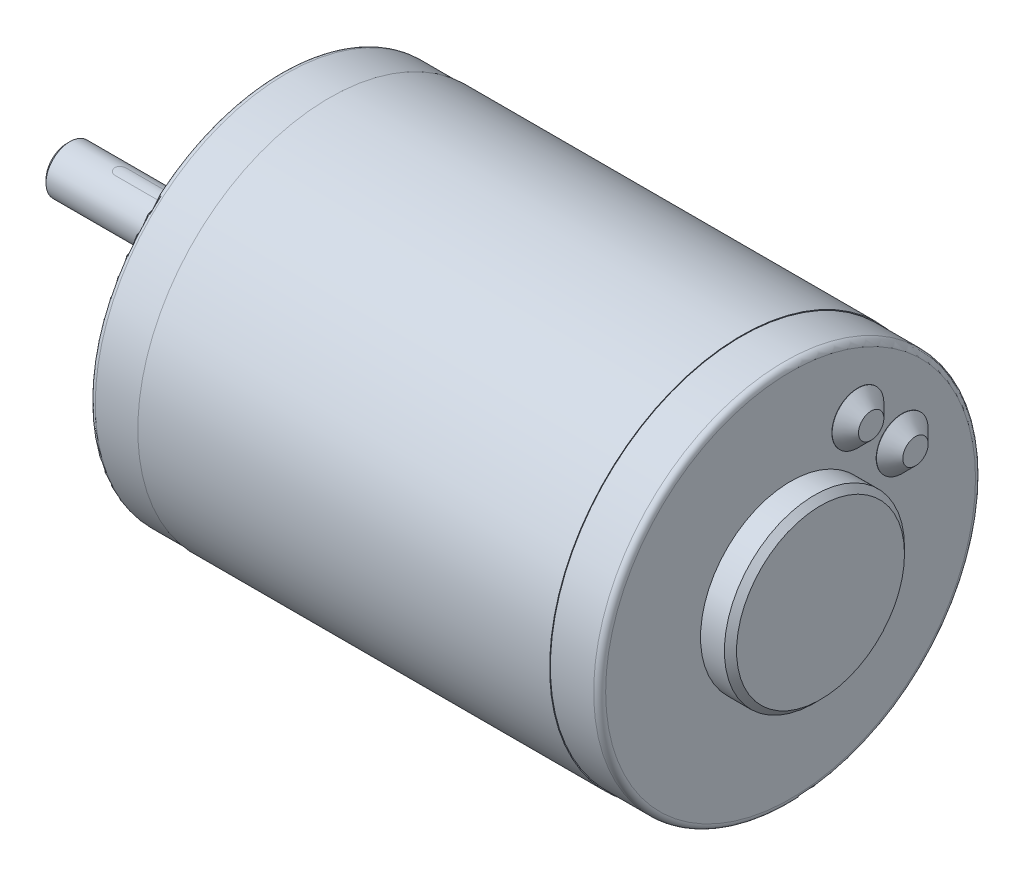
ISO-10303-21;
HEADER;
FILE_DESCRIPTION(('STEP AP214'),'2;1');
FILE_NAME('part.step','',(''),(''),'','','');
FILE_SCHEMA(('AUTOMOTIVE_DESIGN { 1 0 10303 214 1 1 1 1 }'));
ENDSEC;
DATA;
#1=APPLICATION_CONTEXT('core data for automotive mechanical design processes');
#2=APPLICATION_PROTOCOL_DEFINITION('international standard','automotive_design',2000,#1);
#3=PRODUCT_CONTEXT('',#1,'mechanical');
#4=PRODUCT('Part','Part','',(#3));
#5=PRODUCT_RELATED_PRODUCT_CATEGORY('part','',(#4));
#6=PRODUCT_DEFINITION_FORMATION('','',#4);
#7=PRODUCT_DEFINITION_CONTEXT('part definition',#1,'design');
#8=PRODUCT_DEFINITION('design','',#6,#7);
#9=PRODUCT_DEFINITION_SHAPE('','',#8);
#10=(LENGTH_UNIT() NAMED_UNIT(*) SI_UNIT(.MILLI.,.METRE.));
#11=(NAMED_UNIT(*) PLANE_ANGLE_UNIT() SI_UNIT($,.RADIAN.));
#12=(NAMED_UNIT(*) SI_UNIT($,.STERADIAN.) SOLID_ANGLE_UNIT());
#13=UNCERTAINTY_MEASURE_WITH_UNIT(LENGTH_MEASURE(1.E-05),#10,'distance_accuracy_value','');
#14=(GEOMETRIC_REPRESENTATION_CONTEXT(3) GLOBAL_UNCERTAINTY_ASSIGNED_CONTEXT((#13)) GLOBAL_UNIT_ASSIGNED_CONTEXT((#10,
#11,#12)) REPRESENTATION_CONTEXT('',''));
#15=CARTESIAN_POINT('',(0.,0.,0.));
#16=DIRECTION('',(0.,0.,1.));
#17=DIRECTION('',(1.,0.,0.));
#18=AXIS2_PLACEMENT_3D('',#15,#16,#17);
#19=CARTESIAN_POINT('',(-4.,0.,0.));
#20=DIRECTION('',(-1.,0.,0.));
#21=DIRECTION('',(0.,0.,1.));
#22=AXIS2_PLACEMENT_3D('',#19,#20,#21);
#23=PLANE('',#22);
#24=CARTESIAN_POINT('',(-4.,0.,0.));
#25=DIRECTION('',(-1.,0.,0.));
#26=DIRECTION('',(0.,0.,1.));
#27=AXIS2_PLACEMENT_3D('',#24,#25,#26);
#28=CIRCLE('',#27,8.50900000000003);
#29=CARTESIAN_POINT('',(-4.,0.,8.50900000000003));
#30=VERTEX_POINT('',#29);
#31=EDGE_CURVE('P0_E191',#30,#30,#28,.T.);
#32=ORIENTED_EDGE('',*,*,#31,.T.);
#33=EDGE_LOOP('',(#32));
#34=FACE_BOUND('',#33,.T.);
#35=CARTESIAN_POINT('',(-4.,0.,0.));
#36=DIRECTION('',(-1.,0.,0.));
#37=DIRECTION('',(0.,0.,1.));
#38=AXIS2_PLACEMENT_3D('',#35,#36,#37);
#39=CIRCLE('',#38,4.);
#40=CARTESIAN_POINT('',(-4.,0.,4.));
#41=VERTEX_POINT('',#40);
#42=EDGE_CURVE('P0_E123',#41,#41,#39,.T.);
#43=ORIENTED_EDGE('',*,*,#42,.F.);
#44=EDGE_LOOP('',(#43));
#45=FACE_BOUND('',#44,.T.);
#46=ADVANCED_FACE('P0_F40',(#34,#45),#23,.T.);
#47=CARTESIAN_POINT('',(0.,0.,0.));
#48=DIRECTION('',(-1.,0.,0.));
#49=DIRECTION('',(0.,0.,1.));
#50=AXIS2_PLACEMENT_3D('',#47,#48,#49);
#51=PLANE('',#50);
#52=CARTESIAN_POINT('',(0.,0.,0.));
#53=DIRECTION('',(-1.,0.,0.));
#54=DIRECTION('',(0.,0.,1.));
#55=AXIS2_PLACEMENT_3D('',#52,#53,#54);
#56=CIRCLE('',#55,30.877);
#57=CARTESIAN_POINT('',(0.,0.,30.877));
#58=VERTEX_POINT('',#57);
#59=EDGE_CURVE('P0_E209',#58,#58,#56,.T.);
#60=ORIENTED_EDGE('',*,*,#59,.T.);
#61=EDGE_LOOP('',(#60));
#62=FACE_BOUND('',#61,.T.);
#63=CARTESIAN_POINT('',(0.,25.4,0.));
#64=DIRECTION('',(-1.,0.,0.));
#65=DIRECTION('',(0.,0.,1.));
#66=AXIS2_PLACEMENT_3D('',#63,#64,#65);
#67=CIRCLE('',#66,2.0193);
#68=CARTESIAN_POINT('',(0.,25.4,2.0193));
#69=VERTEX_POINT('',#68);
#70=EDGE_CURVE('P0_E97',#69,#69,#67,.T.);
#71=ORIENTED_EDGE('',*,*,#70,.F.);
#72=EDGE_LOOP('',(#71));
#73=FACE_BOUND('',#72,.T.);
#74=CARTESIAN_POINT('',(0.,-25.4,0.));
#75=DIRECTION('',(-1.,0.,0.));
#76=DIRECTION('',(0.,0.,1.));
#77=AXIS2_PLACEMENT_3D('',#74,#75,#76);
#78=CIRCLE('',#77,2.0193);
#79=CARTESIAN_POINT('',(0.,-25.4,2.0193));
#80=VERTEX_POINT('',#79);
#81=EDGE_CURVE('P0_E96',#80,#80,#78,.T.);
#82=ORIENTED_EDGE('',*,*,#81,.F.);
#83=EDGE_LOOP('',(#82));
#84=FACE_BOUND('',#83,.T.);
#85=CARTESIAN_POINT('',(0.,0.,0.));
#86=DIRECTION('',(-1.,0.,0.));
#87=DIRECTION('',(0.,0.,1.));
#88=AXIS2_PLACEMENT_3D('',#85,#86,#87);
#89=CIRCLE('',#88,9.525);
#90=CARTESIAN_POINT('',(0.,0.,9.525));
#91=VERTEX_POINT('',#90);
#92=EDGE_CURVE('P0_E167',#91,#91,#89,.T.);
#93=ORIENTED_EDGE('',*,*,#92,.F.);
#94=EDGE_LOOP('',(#93));
#95=FACE_BOUND('',#94,.T.);
#96=ADVANCED_FACE('P0_F230',(#62,#73,#84,#95),#51,.T.);
#97=CARTESIAN_POINT('',(8.2296,0.,0.));
#98=DIRECTION('',(1.,0.,0.));
#99=DIRECTION('',(0.,0.,-1.));
#100=AXIS2_PLACEMENT_3D('',#97,#98,#99);
#101=PLANE('',#100);
#102=CARTESIAN_POINT('',(8.2296,0.,0.));
#103=DIRECTION('',(-1.,0.,0.));
#104=DIRECTION('',(0.,0.,-1.));
#105=AXIS2_PLACEMENT_3D('',#102,#103,#104);
#106=CIRCLE('',#105,32.004);
#107=CARTESIAN_POINT('',(8.2296,0.,-32.004));
#108=VERTEX_POINT('',#107);
#109=EDGE_CURVE('P0_E176',#108,#108,#106,.T.);
#110=ORIENTED_EDGE('',*,*,#109,.T.);
#111=EDGE_LOOP('',(#110));
#112=FACE_BOUND('',#111,.T.);
#113=CARTESIAN_POINT('',(8.2296,0.,0.));
#114=DIRECTION('',(1.,0.,0.));
#115=DIRECTION('',(0.,0.,-1.));
#116=AXIS2_PLACEMENT_3D('',#113,#114,#115);
#117=CIRCLE('',#116,31.877);
#118=CARTESIAN_POINT('',(8.2296,0.,-31.877));
#119=VERTEX_POINT('',#118);
#120=EDGE_CURVE('P0_E180',#119,#119,#117,.F.);
#121=ORIENTED_EDGE('',*,*,#120,.F.);
#122=EDGE_LOOP('',(#121));
#123=FACE_BOUND('',#122,.T.);
#124=ADVANCED_FACE('P0_F236',(#112,#123),#101,.F.);
#125=CARTESIAN_POINT('',(85.216,0.,0.));
#126=DIRECTION('',(1.,0.,0.));
#127=DIRECTION('',(0.,0.,-1.));
#128=AXIS2_PLACEMENT_3D('',#125,#126,#127);
#129=PLANE('',#128);
#130=CARTESIAN_POINT('',(85.216,0.,0.));
#131=DIRECTION('',(1.,0.,0.));
#132=DIRECTION('',(0.,0.,-1.));
#133=AXIS2_PLACEMENT_3D('',#130,#131,#132);
#134=CIRCLE('',#133,30.877);
#135=CARTESIAN_POINT('',(85.216,0.,-30.877));
#136=VERTEX_POINT('',#135);
#137=EDGE_CURVE('P0_E48',#136,#136,#134,.T.);
#138=ORIENTED_EDGE('',*,*,#137,.T.);
#139=EDGE_LOOP('',(#138));
#140=FACE_BOUND('',#139,.T.);
#141=CARTESIAN_POINT('',(85.216,18.6070906828553,-11.2073596390943));
#142=DIRECTION('',(1.,0.,0.));
#143=DIRECTION('',(0.,0.,-1.));
#144=AXIS2_PLACEMENT_3D('',#141,#142,#143);
#145=CIRCLE('',#144,4.318);
#146=CARTESIAN_POINT('',(85.216,18.6070906828553,-15.5253596390943));
#147=VERTEX_POINT('',#146);
#148=EDGE_CURVE('P0_E188',#147,#147,#145,.T.);
#149=ORIENTED_EDGE('',*,*,#148,.F.);
#150=EDGE_LOOP('',(#149));
#151=FACE_BOUND('',#150,.T.);
#152=CARTESIAN_POINT('',(85.216,11.2073596390943,-18.6070906828553));
#153=DIRECTION('',(1.,0.,0.));
#154=DIRECTION('',(0.,0.,-1.));
#155=AXIS2_PLACEMENT_3D('',#152,#153,#154);
#156=CIRCLE('',#155,4.318);
#157=CARTESIAN_POINT('',(85.216,11.2073596390943,-22.9250906828553));
#158=VERTEX_POINT('',#157);
#159=EDGE_CURVE('P0_E185',#158,#158,#156,.T.);
#160=ORIENTED_EDGE('',*,*,#159,.F.);
#161=EDGE_LOOP('',(#160));
#162=FACE_BOUND('',#161,.T.);
#163=CARTESIAN_POINT('',(85.216,0.,0.));
#164=DIRECTION('',(1.,0.,0.));
#165=DIRECTION('',(0.,0.,-1.));
#166=AXIS2_PLACEMENT_3D('',#163,#164,#165);
#167=CIRCLE('',#166,15.0368);
#168=CARTESIAN_POINT('',(85.216,0.,-15.0368));
#169=VERTEX_POINT('',#168);
#170=EDGE_CURVE('P0_E170',#169,#169,#167,.T.);
#171=ORIENTED_EDGE('',*,*,#170,.F.);
#172=EDGE_LOOP('',(#171));
#173=FACE_BOUND('',#172,.T.);
#174=ADVANCED_FACE('P0_F217',(#140,#151,#162,#173),#129,.T.);
#175=CARTESIAN_POINT('',(76.9864,0.,0.));
#176=DIRECTION('',(1.,0.,0.));
#177=DIRECTION('',(0.,0.,-1.));
#178=AXIS2_PLACEMENT_3D('',#175,#176,#177);
#179=PLANE('',#178);
#180=CARTESIAN_POINT('',(76.9864,0.,0.));
#181=DIRECTION('',(-1.,0.,0.));
#182=DIRECTION('',(0.,0.,-1.));
#183=AXIS2_PLACEMENT_3D('',#180,#181,#182);
#184=CIRCLE('',#183,32.004);
#185=CARTESIAN_POINT('',(76.9864,0.,-32.004));
#186=VERTEX_POINT('',#185);
#187=EDGE_CURVE('P0_E177',#186,#186,#184,.T.);
#188=ORIENTED_EDGE('',*,*,#187,.F.);
#189=EDGE_LOOP('',(#188));
#190=FACE_BOUND('',#189,.T.);
#191=CARTESIAN_POINT('',(76.9864,0.,0.));
#192=DIRECTION('',(1.,0.,0.));
#193=DIRECTION('',(0.,0.,-1.));
#194=AXIS2_PLACEMENT_3D('',#191,#192,#193);
#195=CIRCLE('',#194,31.877);
#196=CARTESIAN_POINT('',(76.9864,0.,-31.877));
#197=VERTEX_POINT('',#196);
#198=EDGE_CURVE('P0_E173',#197,#197,#195,.T.);
#199=ORIENTED_EDGE('',*,*,#198,.F.);
#200=EDGE_LOOP('',(#199));
#201=FACE_BOUND('',#200,.T.);
#202=ADVANCED_FACE('P0_F263',(#190,#201),#179,.T.);
#203=CARTESIAN_POINT('',(76.9864,0.,0.));
#204=DIRECTION('',(-1.,0.,0.));
#205=DIRECTION('',(0.,0.,1.));
#206=AXIS2_PLACEMENT_3D('',#203,#204,#205);
#207=CYLINDRICAL_SURFACE('',#206,32.004);
#208=ORIENTED_EDGE('',*,*,#187,.T.);
#209=EDGE_LOOP('',(#208));
#210=FACE_BOUND('',#209,.T.);
#211=ORIENTED_EDGE('',*,*,#109,.F.);
#212=EDGE_LOOP('',(#211));
#213=FACE_BOUND('',#212,.T.);
#214=ADVANCED_FACE('P0_F266',(#210,#213),#207,.T.);
#215=CARTESIAN_POINT('',(85.216,0.,0.));
#216=DIRECTION('',(-1.,0.,0.));
#217=DIRECTION('',(0.,0.,1.));
#218=AXIS2_PLACEMENT_3D('',#215,#216,#217);
#219=CYLINDRICAL_SURFACE('',#218,31.877);
#220=CARTESIAN_POINT('',(84.216,0.,0.));
#221=DIRECTION('',(1.,0.,0.));
#222=DIRECTION('',(0.,0.,-1.));
#223=AXIS2_PLACEMENT_3D('',#220,#221,#222);
#224=CIRCLE('',#223,31.877);
#225=CARTESIAN_POINT('',(84.216,0.,-31.877));
#226=VERTEX_POINT('',#225);
#227=EDGE_CURVE('P0_E11',#226,#226,#224,.F.);
#228=ORIENTED_EDGE('',*,*,#227,.T.);
#229=EDGE_LOOP('',(#228));
#230=FACE_BOUND('',#229,.T.);
#231=ORIENTED_EDGE('',*,*,#198,.T.);
#232=EDGE_LOOP('',(#231));
#233=FACE_BOUND('',#232,.T.);
#234=ADVANCED_FACE('P0_F259',(#230,#233),#219,.T.);
#235=CARTESIAN_POINT('',(90.216,0.,0.));
#236=DIRECTION('',(-1.,0.,0.));
#237=DIRECTION('',(0.,0.,1.));
#238=AXIS2_PLACEMENT_3D('',#235,#236,#237);
#239=CYLINDRICAL_SURFACE('',#238,15.0368);
#240=CARTESIAN_POINT('',(89.2,0.,0.));
#241=DIRECTION('',(1.,0.,0.));
#242=DIRECTION('',(0.,0.,-1.));
#243=AXIS2_PLACEMENT_3D('',#240,#241,#242);
#244=CIRCLE('',#243,15.0368);
#245=CARTESIAN_POINT('',(89.2,0.,-15.0368));
#246=VERTEX_POINT('',#245);
#247=EDGE_CURVE('P0_E200',#246,#246,#244,.F.);
#248=ORIENTED_EDGE('',*,*,#247,.T.);
#249=EDGE_LOOP('',(#248));
#250=FACE_BOUND('',#249,.T.);
#251=ORIENTED_EDGE('',*,*,#170,.T.);
#252=EDGE_LOOP('',(#251));
#253=FACE_BOUND('',#252,.T.);
#254=ADVANCED_FACE('P0_F255',(#250,#253),#239,.T.);
#255=CARTESIAN_POINT('',(90.216,0.,0.));
#256=DIRECTION('',(1.,0.,0.));
#257=DIRECTION('',(0.,0.,-1.));
#258=AXIS2_PLACEMENT_3D('',#255,#256,#257);
#259=PLANE('',#258);
#260=CARTESIAN_POINT('',(90.216,0.,0.));
#261=DIRECTION('',(1.,0.,0.));
#262=DIRECTION('',(0.,0.,-1.));
#263=AXIS2_PLACEMENT_3D('',#260,#261,#262);
#264=CIRCLE('',#263,14.0208);
#265=CARTESIAN_POINT('',(90.216,0.,-14.0208));
#266=VERTEX_POINT('',#265);
#267=EDGE_CURVE('P0_E197',#266,#266,#264,.T.);
#268=ORIENTED_EDGE('',*,*,#267,.T.);
#269=EDGE_LOOP('',(#268));
#270=FACE_BOUND('',#269,.T.);
#271=ADVANCED_FACE('P0_F251',(#270),#259,.T.);
#272=CARTESIAN_POINT('',(0.,0.,0.));
#273=DIRECTION('',(1.,0.,0.));
#274=DIRECTION('',(0.,0.,-1.));
#275=AXIS2_PLACEMENT_3D('',#272,#273,#274);
#276=CYLINDRICAL_SURFACE('',#275,31.877);
#277=CARTESIAN_POINT('',(0.999999999999997,0.,0.));
#278=DIRECTION('',(-1.,0.,0.));
#279=DIRECTION('',(0.,0.,1.));
#280=AXIS2_PLACEMENT_3D('',#277,#278,#279);
#281=CIRCLE('',#280,31.877);
#282=CARTESIAN_POINT('',(0.999999999999997,0.,31.877));
#283=VERTEX_POINT('',#282);
#284=EDGE_CURVE('P0_E212',#283,#283,#281,.F.);
#285=ORIENTED_EDGE('',*,*,#284,.T.);
#286=EDGE_LOOP('',(#285));
#287=FACE_BOUND('',#286,.T.);
#288=ORIENTED_EDGE('',*,*,#120,.T.);
#289=EDGE_LOOP('',(#288));
#290=FACE_BOUND('',#289,.T.);
#291=ADVANCED_FACE('P0_F246',(#287,#290),#276,.T.);
#292=CARTESIAN_POINT('',(-4.,0.,0.));
#293=DIRECTION('',(1.,0.,0.));
#294=DIRECTION('',(0.,0.,-1.));
#295=AXIS2_PLACEMENT_3D('',#292,#293,#294);
#296=CYLINDRICAL_SURFACE('',#295,9.525);
#297=CARTESIAN_POINT('',(-2.98400000000003,0.,0.));
#298=DIRECTION('',(-1.,0.,0.));
#299=DIRECTION('',(0.,0.,1.));
#300=AXIS2_PLACEMENT_3D('',#297,#298,#299);
#301=CIRCLE('',#300,9.525);
#302=CARTESIAN_POINT('',(-2.98400000000003,0.,9.525));
#303=VERTEX_POINT('',#302);
#304=EDGE_CURVE('P0_E194',#303,#303,#301,.F.);
#305=ORIENTED_EDGE('',*,*,#304,.T.);
#306=EDGE_LOOP('',(#305));
#307=FACE_BOUND('',#306,.T.);
#308=ORIENTED_EDGE('',*,*,#92,.T.);
#309=EDGE_LOOP('',(#308));
#310=FACE_BOUND('',#309,.T.);
#311=ADVANCED_FACE('P0_F244',(#307,#310),#296,.T.);
#312=CARTESIAN_POINT('',(-35.6,0.,0.));
#313=DIRECTION('',(1.,0.,0.));
#314=DIRECTION('',(0.,0.,-1.));
#315=AXIS2_PLACEMENT_3D('',#312,#313,#314);
#316=CYLINDRICAL_SURFACE('',#315,4.);
#317=CARTESIAN_POINT('',(-35.0999999999929,0.,0.));
#318=DIRECTION('',(-1.,0.,0.));
#319=DIRECTION('',(0.,0.,1.));
#320=AXIS2_PLACEMENT_3D('',#317,#318,#319);
#321=CIRCLE('',#320,4.);
#322=CARTESIAN_POINT('',(-35.0999999999929,0.,4.));
#323=VERTEX_POINT('',#322);
#324=EDGE_CURVE('P0_E206',#323,#323,#321,.F.);
#325=ORIENTED_EDGE('',*,*,#324,.T.);
#326=EDGE_LOOP('',(#325));
#327=FACE_BOUND('',#326,.T.);
#328=DIRECTION('',(1.,0.,0.));
#329=VECTOR('',#328,1.);
#330=CARTESIAN_POINT('',(0.,3.87298334620741,-1.));
#331=LINE('',#330,#329);
#332=CARTESIAN_POINT('',(-26.6,3.87298334620741,-1.));
#333=VERTEX_POINT('',#332);
#334=CARTESIAN_POINT('',(-7.1,3.87298334620741,-1.));
#335=VERTEX_POINT('',#334);
#336=EDGE_CURVE('P0_E142',#333,#335,#331,.T.);
#337=ORIENTED_EDGE('',*,*,#336,.T.);
#338=CARTESIAN_POINT('',(-7.1,3.87298334620741,-1.));
#339=CARTESIAN_POINT('',(-7.07233701489346,3.87298148580177,-1.00000033749611));
#340=CARTESIAN_POINT('',(-7.04468773698177,3.8732800994947,-0.998851407375366));
#341=CARTESIAN_POINT('',(-6.98959596469644,3.87445904774558,-0.994271295395754));
#342=CARTESIAN_POINT('',(-6.96215343631291,3.87533928441687,-0.990840497572679));
#343=CARTESIAN_POINT('',(-6.88054682679116,3.87881710972053,-0.977175239382526));
#344=CARTESIAN_POINT('',(-6.82694353151779,3.88225203148808,-0.963567695172493));
#345=CARTESIAN_POINT('',(-6.72287532621804,3.89095422588002,-0.927798076247997));
#346=CARTESIAN_POINT('',(-6.67241012178714,3.89622132630929,-0.905636805423836));
#347=CARTESIAN_POINT('',(-6.57588855135267,3.90799134471939,-0.853415378025865));
#348=CARTESIAN_POINT('',(-6.52983337210904,3.91449459395647,-0.823353103356933));
#349=CARTESIAN_POINT('',(-6.4424561180939,3.92816262398025,-0.755484471828069));
#350=CARTESIAN_POINT('',(-6.40124511375448,3.93533791028915,-0.717537268783976));
#351=CARTESIAN_POINT('',(-6.32569791051729,3.94945104396193,-0.63527578051623));
#352=CARTESIAN_POINT('',(-6.29136281053206,3.95638885322537,-0.590960479478831));
#353=CARTESIAN_POINT('',(-6.23008899838136,3.96936182283248,-0.496456899401691));
#354=CARTESIAN_POINT('',(-6.20326010401603,3.9753830468173,-0.446195340334474));
#355=CARTESIAN_POINT('',(-6.1584752658033,3.98572346250588,-0.341702590842919));
#356=CARTESIAN_POINT('',(-6.14051757570017,3.990042989147,-0.28747218408301));
#357=CARTESIAN_POINT('',(-6.11434100722257,3.99641900005128,-0.17774410852516));
#358=CARTESIAN_POINT('',(-6.10593232757718,3.998519529013,-0.122294322002858));
#359=CARTESIAN_POINT('',(-6.09849662845671,4.00037438150815,-0.0107327756816796));
#360=CARTESIAN_POINT('',(-6.09946842980766,4.00012899993444,0.0453789000287057));
#361=CARTESIAN_POINT('',(-6.11062996368545,3.99735237365735,0.155352492972096));
#362=CARTESIAN_POINT('',(-6.12061461659948,3.9948719867736,0.209236701739855));
#363=CARTESIAN_POINT('',(-6.14918867918275,3.98796330636495,0.31453871108434));
#364=CARTESIAN_POINT('',(-6.16777846956858,3.98353492665556,0.365956402423988));
#365=CARTESIAN_POINT('',(-6.21320128067065,3.97314997761798,0.465407286024539));
#366=CARTESIAN_POINT('',(-6.24010739423284,3.96717993827555,0.513405629602248));
#367=CARTESIAN_POINT('',(-6.30134312983347,3.95435945541919,0.604276631230014));
#368=CARTESIAN_POINT('',(-6.33567387025322,3.94750887933198,0.647148515562289));
#369=CARTESIAN_POINT('',(-6.41187891208131,3.93345566022865,0.72776938970849));
#370=CARTESIAN_POINT('',(-6.45393163653981,3.92624850477685,0.765349103054127));
#371=CARTESIAN_POINT('',(-6.54382986692773,3.91246168284006,0.832969575186237));
#372=CARTESIAN_POINT('',(-6.59167695328356,3.90588218842993,0.863008270245062));
#373=CARTESIAN_POINT('',(-6.69214559782377,3.89407813586325,0.914804709285962));
#374=CARTESIAN_POINT('',(-6.74479146489609,3.88886106009136,0.936517017887269));
#375=CARTESIAN_POINT('',(-6.85311692841829,3.88047058807055,0.970702351849829));
#376=CARTESIAN_POINT('',(-6.90879185514984,3.87729413761435,0.983189189212132));
#377=CARTESIAN_POINT('',(-6.9874573807589,3.87455290681524,0.993904635150938));
#378=CARTESIAN_POINT('',(-7.00991970321318,3.87396523110859,0.996190790966708));
#379=CARTESIAN_POINT('',(-7.05491778990932,3.87318062488974,0.999236757697394));
#380=CARTESIAN_POINT('',(-7.07745337595529,3.87298306219461,0.999999038096045));
#381=CARTESIAN_POINT('',(-7.1,3.87298334620741,1.));
#382=B_SPLINE_CURVE_WITH_KNOTS('',3,(#338,#339,#340,#341,#342,#343,#344,#345,#346,#347,#348,
#349,#350,#351,#352,#353,#354,#355,#356,#357,#358,#359,#360,#361,#362,#363,#364,#365,#366,#367,
#368,#369,#370,#371,#372,#373,#374,#375,#376,#377,#378,#379,#380,#381),.UNSPECIFIED.,.F.,.F.,(4,
2,2,2,2,2,2,2,2,2,2,2,2,2,2,2,2,2,2,2,2,4),(0.,0.0829365303397693,0.165859106084651,
0.331229963080317,0.496585282091498,0.661984974726749,0.830641897427974,0.999325753539193,
1.17036187098235,1.34136430732424,1.50890481515325,1.67642426256639,1.84022545479276,
2.00403389475838,2.16932509450376,2.33464120964329,2.50441429534542,2.67423379180967,
2.84496720161068,3.01544447539986,3.08315848722648,3.15076267731671),.UNSPECIFIED.);
#383=CARTESIAN_POINT('',(-7.1,3.87298334620741,1.));
#384=VERTEX_POINT('',#383);
#385=EDGE_CURVE('P0_E119',#335,#384,#382,.T.);
#386=ORIENTED_EDGE('',*,*,#385,.T.);
#387=DIRECTION('',(1.,0.,0.));
#388=VECTOR('',#387,1.);
#389=CARTESIAN_POINT('',(0.,3.87298334620741,1.));
#390=LINE('',#389,#388);
#391=CARTESIAN_POINT('',(-26.6,3.87298334620741,1.));
#392=VERTEX_POINT('',#391);
#393=EDGE_CURVE('P0_E157',#384,#392,#390,.F.);
#394=ORIENTED_EDGE('',*,*,#393,.T.);
#395=CARTESIAN_POINT('',(-26.6,3.87298334620741,1.));
#396=CARTESIAN_POINT('',(-26.6276629851065,3.87298148580177,1.00000033749611));
#397=CARTESIAN_POINT('',(-26.6553122630182,3.8732800994947,0.998851407375366));
#398=CARTESIAN_POINT('',(-26.7104040353036,3.87445904774558,0.994271295395754));
#399=CARTESIAN_POINT('',(-26.7378465636871,3.87533928441687,0.990840497572679));
#400=CARTESIAN_POINT('',(-26.8194531732088,3.87881710972053,0.977175239382526));
#401=CARTESIAN_POINT('',(-26.8730564684822,3.88225203148808,0.963567695172493));
#402=CARTESIAN_POINT('',(-26.977124673782,3.89095422588002,0.927798076247996));
#403=CARTESIAN_POINT('',(-27.0275898782129,3.89622132630929,0.905636805423835));
#404=CARTESIAN_POINT('',(-27.1241114486473,3.90799134471939,0.853415378025864));
#405=CARTESIAN_POINT('',(-27.170166627891,3.91449459395647,0.823353103356932));
#406=CARTESIAN_POINT('',(-27.2575438819061,3.92816262398025,0.755484471828069));
#407=CARTESIAN_POINT('',(-27.2987548862455,3.93533791028915,0.717537268783975));
#408=CARTESIAN_POINT('',(-27.3743020894827,3.94945104396193,0.635275780516229));
#409=CARTESIAN_POINT('',(-27.4086371894679,3.95638885322537,0.59096047947883));
#410=CARTESIAN_POINT('',(-27.4699110016186,3.96936182283248,0.496456899401689));
#411=CARTESIAN_POINT('',(-27.496739895984,3.9753830468173,0.446195340334472));
#412=CARTESIAN_POINT('',(-27.5415247341967,3.98572346250588,0.341702590842916));
#413=CARTESIAN_POINT('',(-27.5594824242998,3.990042989147,0.287472184083007));
#414=CARTESIAN_POINT('',(-27.5856589927774,3.99641900005128,0.177744108525158));
#415=CARTESIAN_POINT('',(-27.5940676724228,3.998519529013,0.122294322002856));
#416=CARTESIAN_POINT('',(-27.6015033715433,4.00037438150815,0.0107327756816781));
#417=CARTESIAN_POINT('',(-27.6005315701923,4.00012899993444,-0.0453789000287067));
#418=CARTESIAN_POINT('',(-27.5893700363146,3.99735237365735,-0.155352492972096));
#419=CARTESIAN_POINT('',(-27.5793853834005,3.9948719867736,-0.209236701739855));
#420=CARTESIAN_POINT('',(-27.5508113208173,3.98796330636495,-0.31453871108434));
#421=CARTESIAN_POINT('',(-27.5322215304314,3.98353492665556,-0.365956402423988));
#422=CARTESIAN_POINT('',(-27.4867987193294,3.97314997761798,-0.46540728602454));
#423=CARTESIAN_POINT('',(-27.4598926057672,3.96717993827555,-0.513405629602248));
#424=CARTESIAN_POINT('',(-27.3986568701665,3.95435945541919,-0.604276631230015));
#425=CARTESIAN_POINT('',(-27.3643261297468,3.94750887933198,-0.64714851556229));
#426=CARTESIAN_POINT('',(-27.2881210879187,3.93345566022865,-0.727769389708492));
#427=CARTESIAN_POINT('',(-27.2460683634602,3.92624850477685,-0.765349103054128));
#428=CARTESIAN_POINT('',(-27.1561701330723,3.91246168284006,-0.832969575186237));
#429=CARTESIAN_POINT('',(-27.1083230467164,3.90588218842993,-0.863008270245062));
#430=CARTESIAN_POINT('',(-27.0078544021762,3.89407813586325,-0.914804709285961));
#431=CARTESIAN_POINT('',(-26.9552085351039,3.88886106009136,-0.936517017887269));
#432=CARTESIAN_POINT('',(-26.8468830715817,3.88047058807054,-0.970702351849828));
#433=CARTESIAN_POINT('',(-26.7912081448502,3.87729413761435,-0.983189189212131));
#434=CARTESIAN_POINT('',(-26.7125426192411,3.87455290681524,-0.993904635150938));
#435=CARTESIAN_POINT('',(-26.6900802967868,3.87396523110859,-0.996190790966708));
#436=CARTESIAN_POINT('',(-26.6450822100907,3.87318062488974,-0.999236757697394));
#437=CARTESIAN_POINT('',(-26.6225466240447,3.87298306219461,-0.999999038096045));
#438=CARTESIAN_POINT('',(-26.6,3.87298334620741,-1.));
#439=B_SPLINE_CURVE_WITH_KNOTS('',3,(#395,#396,#397,#398,#399,#400,#401,#402,#403,#404,#405,
#406,#407,#408,#409,#410,#411,#412,#413,#414,#415,#416,#417,#418,#419,#420,#421,#422,#423,#424,
#425,#426,#427,#428,#429,#430,#431,#432,#433,#434,#435,#436,#437,#438),.UNSPECIFIED.,.F.,.F.,(4,
2,2,2,2,2,2,2,2,2,2,2,2,2,2,2,2,2,2,2,2,4),(0.,0.0829365303397727,0.165859106084653,
0.331229963080318,0.496585282091499,0.661984974726751,0.830641897427976,0.999325753539196,
1.17036187098235,1.34136430732425,1.50890481515325,1.67642426256639,1.84022545479276,
2.00403389475838,2.16932509450376,2.33464120964329,2.50441429534542,2.67423379180967,
2.84496720161068,3.01544447539986,3.08315848722649,3.15076267731671),.UNSPECIFIED.);
#440=EDGE_CURVE('P0_E55',#392,#333,#439,.T.);
#441=ORIENTED_EDGE('',*,*,#440,.T.);
#442=EDGE_LOOP('',(#337,#386,#394,#441));
#443=FACE_BOUND('',#442,.T.);
#444=ORIENTED_EDGE('',*,*,#42,.T.);
#445=EDGE_LOOP('',(#444));
#446=FACE_BOUND('',#445,.T.);
#447=ADVANCED_FACE('P0_F242',(#327,#443,#446),#316,.T.);
#448=CARTESIAN_POINT('',(-35.6,0.,0.));
#449=DIRECTION('',(-1.,0.,0.));
#450=DIRECTION('',(0.,0.,1.));
#451=AXIS2_PLACEMENT_3D('',#448,#449,#450);
#452=PLANE('',#451);
#453=CARTESIAN_POINT('',(-35.6,0.,0.));
#454=DIRECTION('',(-1.,0.,0.));
#455=DIRECTION('',(0.,0.,1.));
#456=AXIS2_PLACEMENT_3D('',#453,#454,#455);
#457=CIRCLE('',#456,3.4999999999361);
#458=CARTESIAN_POINT('',(-35.6,0.,3.4999999999361));
#459=VERTEX_POINT('',#458);
#460=EDGE_CURVE('P0_E203',#459,#459,#457,.T.);
#461=ORIENTED_EDGE('',*,*,#460,.T.);
#462=EDGE_LOOP('',(#461));
#463=FACE_BOUND('',#462,.T.);
#464=ADVANCED_FACE('P0_F293',(#463),#452,.T.);
#465=CARTESIAN_POINT('',(-7.1,32.005,0.));
#466=DIRECTION('',(0.,-1.,0.));
#467=DIRECTION('',(0.,0.,-1.));
#468=AXIS2_PLACEMENT_3D('',#465,#466,#467);
#469=CYLINDRICAL_SURFACE('',#468,1.);
#470=ORIENTED_EDGE('',*,*,#385,.F.);
#471=DIRECTION('',(0.,-1.,0.));
#472=VECTOR('',#471,1.);
#473=CARTESIAN_POINT('',(-7.1,32.005,-1.));
#474=LINE('',#473,#472);
#475=CARTESIAN_POINT('',(-7.1,2.79999999999999,-1.));
#476=VERTEX_POINT('',#475);
#477=EDGE_CURVE('P0_E141',#335,#476,#474,.T.);
#478=ORIENTED_EDGE('',*,*,#477,.T.);
#479=CARTESIAN_POINT('',(-7.1,2.79999999999999,0.));
#480=DIRECTION('',(0.,-1.,0.));
#481=DIRECTION('',(0.,0.,-1.));
#482=AXIS2_PLACEMENT_3D('',#479,#480,#481);
#483=CIRCLE('',#482,1.);
#484=CARTESIAN_POINT('',(-7.1,2.79999999999999,1.));
#485=VERTEX_POINT('',#484);
#486=EDGE_CURVE('P0_E130',#476,#485,#483,.T.);
#487=ORIENTED_EDGE('',*,*,#486,.T.);
#488=DIRECTION('',(0.,-1.,0.));
#489=VECTOR('',#488,1.);
#490=CARTESIAN_POINT('',(-7.1,32.005,1.));
#491=LINE('',#490,#489);
#492=EDGE_CURVE('P0_E63',#384,#485,#491,.T.);
#493=ORIENTED_EDGE('',*,*,#492,.F.);
#494=EDGE_LOOP('',(#470,#478,#487,#493));
#495=FACE_BOUND('',#494,.T.);
#496=ADVANCED_FACE('P0_F295',(#495),#469,.F.);
#497=CARTESIAN_POINT('',(-26.6,32.005,-1.));
#498=DIRECTION('',(0.,0.,-1.));
#499=DIRECTION('',(-1.,0.,0.));
#500=AXIS2_PLACEMENT_3D('',#497,#498,#499);
#501=PLANE('',#500);
#502=ORIENTED_EDGE('',*,*,#336,.F.);
#503=DIRECTION('',(0.,-1.,0.));
#504=VECTOR('',#503,1.);
#505=CARTESIAN_POINT('',(-26.6,32.005,-1.));
#506=LINE('',#505,#504);
#507=CARTESIAN_POINT('',(-26.6,2.79999999999999,-1.));
#508=VERTEX_POINT('',#507);
#509=EDGE_CURVE('P0_E140',#333,#508,#506,.T.);
#510=ORIENTED_EDGE('',*,*,#509,.T.);
#511=DIRECTION('',(1.,0.,0.));
#512=VECTOR('',#511,1.);
#513=CARTESIAN_POINT('',(-26.6,2.79999999999999,-1.));
#514=LINE('',#513,#512);
#515=EDGE_CURVE('P0_E120',#508,#476,#514,.T.);
#516=ORIENTED_EDGE('',*,*,#515,.T.);
#517=ORIENTED_EDGE('',*,*,#477,.F.);
#518=EDGE_LOOP('',(#502,#510,#516,#517));
#519=FACE_BOUND('',#518,.T.);
#520=ADVANCED_FACE('P0_F300',(#519),#501,.F.);
#521=CARTESIAN_POINT('',(-26.6,32.005,0.));
#522=DIRECTION('',(0.,-1.,0.));
#523=DIRECTION('',(0.,0.,-1.));
#524=AXIS2_PLACEMENT_3D('',#521,#522,#523);
#525=CYLINDRICAL_SURFACE('',#524,1.);
#526=ORIENTED_EDGE('',*,*,#440,.F.);
#527=DIRECTION('',(0.,-1.,0.));
#528=VECTOR('',#527,1.);
#529=CARTESIAN_POINT('',(-26.6,32.005,1.));
#530=LINE('',#529,#528);
#531=CARTESIAN_POINT('',(-26.6,2.79999999999999,1.));
#532=VERTEX_POINT('',#531);
#533=EDGE_CURVE('P0_E132',#392,#532,#530,.T.);
#534=ORIENTED_EDGE('',*,*,#533,.T.);
#535=CARTESIAN_POINT('',(-26.6,2.79999999999999,0.));
#536=DIRECTION('',(0.,-1.,0.));
#537=DIRECTION('',(0.,0.,-1.));
#538=AXIS2_PLACEMENT_3D('',#535,#536,#537);
#539=CIRCLE('',#538,1.);
#540=EDGE_CURVE('P0_E124',#532,#508,#539,.T.);
#541=ORIENTED_EDGE('',*,*,#540,.T.);
#542=ORIENTED_EDGE('',*,*,#509,.F.);
#543=EDGE_LOOP('',(#526,#534,#541,#542));
#544=FACE_BOUND('',#543,.T.);
#545=ADVANCED_FACE('P0_F306',(#544),#525,.F.);
#546=CARTESIAN_POINT('',(-7.1,32.005,1.));
#547=DIRECTION('',(0.,0.,1.));
#548=DIRECTION('',(1.,0.,0.));
#549=AXIS2_PLACEMENT_3D('',#546,#547,#548);
#550=PLANE('',#549);
#551=ORIENTED_EDGE('',*,*,#393,.F.);
#552=ORIENTED_EDGE('',*,*,#492,.T.);
#553=DIRECTION('',(-1.,0.,0.));
#554=VECTOR('',#553,1.);
#555=CARTESIAN_POINT('',(-7.1,2.79999999999999,1.));
#556=LINE('',#555,#554);
#557=EDGE_CURVE('P0_E127',#485,#532,#556,.T.);
#558=ORIENTED_EDGE('',*,*,#557,.T.);
#559=ORIENTED_EDGE('',*,*,#533,.F.);
#560=EDGE_LOOP('',(#551,#552,#558,#559));
#561=FACE_BOUND('',#560,.T.);
#562=ADVANCED_FACE('P0_F309',(#561),#550,.F.);
#563=CARTESIAN_POINT('',(-7.1,2.79999999999999,0.));
#564=DIRECTION('',(0.,-1.,0.));
#565=DIRECTION('',(0.,0.,-1.));
#566=AXIS2_PLACEMENT_3D('',#563,#564,#565);
#567=PLANE('',#566);
#568=ORIENTED_EDGE('',*,*,#486,.F.);
#569=ORIENTED_EDGE('',*,*,#515,.F.);
#570=ORIENTED_EDGE('',*,*,#540,.F.);
#571=ORIENTED_EDGE('',*,*,#557,.F.);
#572=EDGE_LOOP('',(#568,#569,#570,#571));
#573=FACE_BOUND('',#572,.T.);
#574=ADVANCED_FACE('P0_F311',(#573),#567,.F.);
#575=CARTESIAN_POINT('',(85.216,11.2073596390943,-18.6070906828553));
#576=DIRECTION('',(1.,0.,0.));
#577=DIRECTION('',(0.,0.,-1.));
#578=AXIS2_PLACEMENT_3D('',#575,#576,#577);
#579=CYLINDRICAL_SURFACE('',#578,4.318);
#580=ORIENTED_EDGE('',*,*,#159,.T.);
#581=EDGE_LOOP('',(#580));
#582=FACE_BOUND('',#581,.T.);
#583=CARTESIAN_POINT('',(85.2639,11.2073596390943,-18.6070906828553));
#584=DIRECTION('',(1.,0.,0.));
#585=DIRECTION('',(0.,0.,-1.));
#586=AXIS2_PLACEMENT_3D('',#583,#584,#585);
#587=CIRCLE('',#586,4.318);
#588=CARTESIAN_POINT('',(85.2639,11.2073596390943,-22.9250906828553));
#589=VERTEX_POINT('',#588);
#590=EDGE_CURVE('P0_E113',#589,#589,#587,.T.);
#591=ORIENTED_EDGE('',*,*,#590,.F.);
#592=EDGE_LOOP('',(#591));
#593=FACE_BOUND('',#592,.T.);
#594=ADVANCED_FACE('P0_F316',(#582,#593),#579,.T.);
#595=CARTESIAN_POINT('',(87.4638999999649,11.2073596390943,-18.6070906828553));
#596=DIRECTION('',(1.,0.,0.));
#597=DIRECTION('',(0.,0.,-1.));
#598=AXIS2_PLACEMENT_3D('',#595,#596,#597);
#599=PLANE('',#598);
#600=CARTESIAN_POINT('',(87.4638999999649,11.2073596390943,-18.6070906828553));
#601=DIRECTION('',(1.,0.,0.));
#602=DIRECTION('',(0.,0.,-1.));
#603=AXIS2_PLACEMENT_3D('',#600,#601,#602);
#604=CIRCLE('',#603,2.11800000003506);
#605=CARTESIAN_POINT('',(87.4638999999649,11.2073596390943,-20.7250906828904));
#606=VERTEX_POINT('',#605);
#607=EDGE_CURVE('P0_E116',#606,#606,#604,.T.);
#608=ORIENTED_EDGE('',*,*,#607,.T.);
#609=EDGE_LOOP('',(#608));
#610=FACE_BOUND('',#609,.T.);
#611=ADVANCED_FACE('P0_F339',(#610),#599,.T.);
#612=CARTESIAN_POINT('',(87.4638999999649,11.2073596390943,-18.6070906828553));
#613=DIRECTION('',(-1.,0.,0.));
#614=DIRECTION('',(0.,0.,1.));
#615=AXIS2_PLACEMENT_3D('',#612,#613,#614);
#616=CONICAL_SURFACE('',#615,2.11800000003506,0.78539816339745);
#617=ORIENTED_EDGE('',*,*,#590,.T.);
#618=EDGE_LOOP('',(#617));
#619=FACE_BOUND('',#618,.T.);
#620=ORIENTED_EDGE('',*,*,#607,.F.);
#621=EDGE_LOOP('',(#620));
#622=FACE_BOUND('',#621,.T.);
#623=ADVANCED_FACE('P0_F345',(#619,#622),#616,.T.);
#624=CARTESIAN_POINT('',(85.216,18.6070906828553,-11.2073596390943));
#625=DIRECTION('',(1.,0.,0.));
#626=DIRECTION('',(0.,0.,-1.));
#627=AXIS2_PLACEMENT_3D('',#624,#625,#626);
#628=CYLINDRICAL_SURFACE('',#627,4.318);
#629=ORIENTED_EDGE('',*,*,#148,.T.);
#630=EDGE_LOOP('',(#629));
#631=FACE_BOUND('',#630,.T.);
#632=CARTESIAN_POINT('',(85.2639,18.6070906828553,-11.2073596390943));
#633=DIRECTION('',(1.,0.,0.));
#634=DIRECTION('',(0.,0.,-1.));
#635=AXIS2_PLACEMENT_3D('',#632,#633,#634);
#636=CIRCLE('',#635,4.318);
#637=CARTESIAN_POINT('',(85.2639,18.6070906828553,-15.5253596390943));
#638=VERTEX_POINT('',#637);
#639=EDGE_CURVE('P0_E107',#638,#638,#636,.T.);
#640=ORIENTED_EDGE('',*,*,#639,.F.);
#641=EDGE_LOOP('',(#640));
#642=FACE_BOUND('',#641,.T.);
#643=ADVANCED_FACE('P0_F349',(#631,#642),#628,.T.);
#644=CARTESIAN_POINT('',(87.4638999999503,18.6070906828553,-11.2073596390943));
#645=DIRECTION('',(1.,0.,0.));
#646=DIRECTION('',(0.,0.,-1.));
#647=AXIS2_PLACEMENT_3D('',#644,#645,#646);
#648=PLANE('',#647);
#649=CARTESIAN_POINT('',(87.4638999999503,18.6070906828553,-11.2073596390943));
#650=DIRECTION('',(1.,0.,0.));
#651=DIRECTION('',(0.,0.,-1.));
#652=AXIS2_PLACEMENT_3D('',#649,#650,#651);
#653=CIRCLE('',#652,2.11800000004973);
#654=CARTESIAN_POINT('',(87.4638999999503,18.6070906828553,-13.3253596391441));
#655=VERTEX_POINT('',#654);
#656=EDGE_CURVE('P0_E110',#655,#655,#653,.T.);
#657=ORIENTED_EDGE('',*,*,#656,.T.);
#658=EDGE_LOOP('',(#657));
#659=FACE_BOUND('',#658,.T.);
#660=ADVANCED_FACE('P0_F353',(#659),#648,.T.);
#661=CARTESIAN_POINT('',(87.4638999999503,18.6070906828553,-11.2073596390943));
#662=DIRECTION('',(-1.,0.,0.));
#663=DIRECTION('',(0.,0.,1.));
#664=AXIS2_PLACEMENT_3D('',#661,#662,#663);
#665=CONICAL_SURFACE('',#664,2.11800000004973,0.785398163397448);
#666=ORIENTED_EDGE('',*,*,#639,.T.);
#667=EDGE_LOOP('',(#666));
#668=FACE_BOUND('',#667,.T.);
#669=ORIENTED_EDGE('',*,*,#656,.F.);
#670=EDGE_LOOP('',(#669));
#671=FACE_BOUND('',#670,.T.);
#672=ADVANCED_FACE('P0_F357',(#668,#671),#665,.T.);
#673=CARTESIAN_POINT('',(12.03,-25.4,0.));
#674=DIRECTION('',(-1.,0.,0.));
#675=DIRECTION('',(0.,0.,1.));
#676=AXIS2_PLACEMENT_3D('',#673,#674,#675);
#677=CONICAL_SURFACE('',#676,2.0193,1.02974425867665);
#678=CARTESIAN_POINT('',(13.2433178480024,-25.4,0.));
#679=VERTEX_POINT('',#678);
#680=VERTEX_LOOP('',#679);
#681=FACE_BOUND('',#680,.T.);
#682=CARTESIAN_POINT('',(12.03,-25.4,0.));
#683=DIRECTION('',(-1.,0.,0.));
#684=DIRECTION('',(0.,0.,1.));
#685=AXIS2_PLACEMENT_3D('',#682,#683,#684);
#686=CIRCLE('',#685,2.0193);
#687=CARTESIAN_POINT('',(12.03,-25.4,2.0193));
#688=VERTEX_POINT('',#687);
#689=EDGE_CURVE('P0_E100',#688,#688,#686,.T.);
#690=ORIENTED_EDGE('',*,*,#689,.T.);
#691=EDGE_LOOP('',(#690));
#692=FACE_BOUND('',#691,.T.);
#693=ADVANCED_FACE('P0_F361',(#681,#692),#677,.F.);
#694=CARTESIAN_POINT('',(0.,-25.4,0.));
#695=DIRECTION('',(-1.,0.,0.));
#696=DIRECTION('',(0.,0.,1.));
#697=AXIS2_PLACEMENT_3D('',#694,#695,#696);
#698=CYLINDRICAL_SURFACE('',#697,2.0193);
#699=ORIENTED_EDGE('',*,*,#689,.F.);
#700=EDGE_LOOP('',(#699));
#701=FACE_BOUND('',#700,.T.);
#702=ORIENTED_EDGE('',*,*,#81,.T.);
#703=EDGE_LOOP('',(#702));
#704=FACE_BOUND('',#703,.T.);
#705=ADVANCED_FACE('P0_F90',(#701,#704),#698,.F.);
#706=CARTESIAN_POINT('',(12.03,25.4,0.));
#707=DIRECTION('',(-1.,0.,0.));
#708=DIRECTION('',(0.,0.,1.));
#709=AXIS2_PLACEMENT_3D('',#706,#707,#708);
#710=CONICAL_SURFACE('',#709,2.0193,1.02974425867665);
#711=CARTESIAN_POINT('',(13.2433178480024,25.4,0.));
#712=VERTEX_POINT('',#711);
#713=VERTEX_LOOP('',#712);
#714=FACE_BOUND('',#713,.T.);
#715=CARTESIAN_POINT('',(12.03,25.4,0.));
#716=DIRECTION('',(-1.,0.,0.));
#717=DIRECTION('',(0.,0.,1.));
#718=AXIS2_PLACEMENT_3D('',#715,#716,#717);
#719=CIRCLE('',#718,2.0193);
#720=CARTESIAN_POINT('',(12.03,25.4,2.0193));
#721=VERTEX_POINT('',#720);
#722=EDGE_CURVE('P0_E94',#721,#721,#719,.T.);
#723=ORIENTED_EDGE('',*,*,#722,.T.);
#724=EDGE_LOOP('',(#723));
#725=FACE_BOUND('',#724,.T.);
#726=ADVANCED_FACE('P0_F86',(#714,#725),#710,.F.);
#727=CARTESIAN_POINT('',(0.,25.4,0.));
#728=DIRECTION('',(-1.,0.,0.));
#729=DIRECTION('',(0.,0.,1.));
#730=AXIS2_PLACEMENT_3D('',#727,#728,#729);
#731=CYLINDRICAL_SURFACE('',#730,2.0193);
#732=ORIENTED_EDGE('',*,*,#722,.F.);
#733=EDGE_LOOP('',(#732));
#734=FACE_BOUND('',#733,.T.);
#735=ORIENTED_EDGE('',*,*,#70,.T.);
#736=EDGE_LOOP('',(#735));
#737=FACE_BOUND('',#736,.T.);
#738=ADVANCED_FACE('P0_F89',(#734,#737),#731,.F.);
#739=CARTESIAN_POINT('',(-4.,0.,0.));
#740=DIRECTION('',(1.,0.,0.));
#741=DIRECTION('',(0.,0.,-1.));
#742=AXIS2_PLACEMENT_3D('',#739,#740,#741);
#743=CONICAL_SURFACE('',#742,8.50900000000003,0.785398163397447);
#744=ORIENTED_EDGE('',*,*,#304,.F.);
#745=EDGE_LOOP('',(#744));
#746=FACE_BOUND('',#745,.T.);
#747=ORIENTED_EDGE('',*,*,#31,.F.);
#748=EDGE_LOOP('',(#747));
#749=FACE_BOUND('',#748,.T.);
#750=ADVANCED_FACE('P0_F277',(#746,#749),#743,.T.);
#751=CARTESIAN_POINT('',(90.216,0.,0.));
#752=DIRECTION('',(-1.,0.,0.));
#753=DIRECTION('',(0.,0.,1.));
#754=AXIS2_PLACEMENT_3D('',#751,#752,#753);
#755=CONICAL_SURFACE('',#754,14.0208,0.785398163397447);
#756=ORIENTED_EDGE('',*,*,#247,.F.);
#757=EDGE_LOOP('',(#756));
#758=FACE_BOUND('',#757,.T.);
#759=ORIENTED_EDGE('',*,*,#267,.F.);
#760=EDGE_LOOP('',(#759));
#761=FACE_BOUND('',#760,.T.);
#762=ADVANCED_FACE('P0_F280',(#758,#761),#755,.T.);
#763=CARTESIAN_POINT('',(-35.6,0.,0.));
#764=DIRECTION('',(1.,0.,0.));
#765=DIRECTION('',(0.,0.,-1.));
#766=AXIS2_PLACEMENT_3D('',#763,#764,#765);
#767=CONICAL_SURFACE('',#766,3.4999999999361,0.785398163454291);
#768=ORIENTED_EDGE('',*,*,#324,.F.);
#769=EDGE_LOOP('',(#768));
#770=FACE_BOUND('',#769,.T.);
#771=ORIENTED_EDGE('',*,*,#460,.F.);
#772=EDGE_LOOP('',(#771));
#773=FACE_BOUND('',#772,.T.);
#774=ADVANCED_FACE('P0_F226',(#770,#773),#767,.T.);
#775=CARTESIAN_POINT('',(0.999999999999997,0.,0.));
#776=DIRECTION('',(-1.,0.,0.));
#777=DIRECTION('',(0.,0.,1.));
#778=AXIS2_PLACEMENT_3D('',#775,#776,#777);
#779=TOROIDAL_SURFACE('',#778,30.877,0.999999999999999);
#780=ORIENTED_EDGE('',*,*,#284,.F.);
#781=EDGE_LOOP('',(#780));
#782=FACE_BOUND('',#781,.T.);
#783=ORIENTED_EDGE('',*,*,#59,.F.);
#784=EDGE_LOOP('',(#783));
#785=FACE_BOUND('',#784,.T.);
#786=ADVANCED_FACE('P0_F221',(#782,#785),#779,.T.);
#787=CARTESIAN_POINT('',(84.216,0.,0.));
#788=DIRECTION('',(1.,0.,0.));
#789=DIRECTION('',(0.,0.,-1.));
#790=AXIS2_PLACEMENT_3D('',#787,#788,#789);
#791=TOROIDAL_SURFACE('',#790,30.877,0.999999999999999);
#792=ORIENTED_EDGE('',*,*,#227,.F.);
#793=EDGE_LOOP('',(#792));
#794=FACE_BOUND('',#793,.T.);
#795=ORIENTED_EDGE('',*,*,#137,.F.);
#796=EDGE_LOOP('',(#795));
#797=FACE_BOUND('',#796,.T.);
#798=ADVANCED_FACE('P0_F42',(#794,#797),#791,.T.);
#799=CLOSED_SHELL('',(#46,#96,#124,#174,#202,#214,#234,#254,#271,#291,#311,#447,#464,#496,#520,
#545,#562,#574,#594,#611,#623,#643,#660,#672,#693,#705,#726,#738,#750,#762,#774,#786,#798));
#800=MANIFOLD_SOLID_BREP('P0_B2',#799);
#801=CARTESIAN_POINT('',(0.,0.,0.));
#802=DIRECTION('',(1.,0.,0.));
#803=DIRECTION('',(0.,0.,-1.));
#804=AXIS2_PLACEMENT_3D('',#801,#802,#803);
#805=CYLINDRICAL_SURFACE('',#804,4.);
#806=DIRECTION('',(1.,0.,0.));
#807=VECTOR('',#806,1.);
#808=CARTESIAN_POINT('',(0.,3.87298334620741,1.));
#809=LINE('',#808,#807);
#810=CARTESIAN_POINT('',(-7.1,3.87298334620741,1.));
#811=VERTEX_POINT('',#810);
#812=CARTESIAN_POINT('',(-26.6,3.87298334620741,1.));
#813=VERTEX_POINT('',#812);
#814=EDGE_CURVE('P1_E30',#811,#813,#809,.F.);
#815=ORIENTED_EDGE('',*,*,#814,.F.);
#816=CARTESIAN_POINT('',(-7.1,3.87298334620741,-1.));
#817=CARTESIAN_POINT('',(-7.07233701489346,3.87298148580177,-1.00000033749611));
#818=CARTESIAN_POINT('',(-7.04468773698177,3.8732800994947,-0.998851407375366));
#819=CARTESIAN_POINT('',(-6.98959596469644,3.87445904774558,-0.994271295395754));
#820=CARTESIAN_POINT('',(-6.96215343631291,3.87533928441687,-0.990840497572679));
#821=CARTESIAN_POINT('',(-6.88054682679116,3.87881710972053,-0.977175239382526));
#822=CARTESIAN_POINT('',(-6.82694353151779,3.88225203148808,-0.963567695172493));
#823=CARTESIAN_POINT('',(-6.72287532621804,3.89095422588002,-0.927798076247997));
#824=CARTESIAN_POINT('',(-6.67241012178714,3.89622132630929,-0.905636805423836));
#825=CARTESIAN_POINT('',(-6.57588855135267,3.90799134471939,-0.853415378025865));
#826=CARTESIAN_POINT('',(-6.52983337210904,3.91449459395647,-0.823353103356933));
#827=CARTESIAN_POINT('',(-6.4424561180939,3.92816262398025,-0.755484471828069));
#828=CARTESIAN_POINT('',(-6.40124511375448,3.93533791028915,-0.717537268783976));
#829=CARTESIAN_POINT('',(-6.32569791051729,3.94945104396193,-0.63527578051623));
#830=CARTESIAN_POINT('',(-6.29136281053206,3.95638885322537,-0.590960479478831));
#831=CARTESIAN_POINT('',(-6.23008899838136,3.96936182283248,-0.496456899401691));
#832=CARTESIAN_POINT('',(-6.20326010401603,3.9753830468173,-0.446195340334474));
#833=CARTESIAN_POINT('',(-6.1584752658033,3.98572346250588,-0.341702590842919));
#834=CARTESIAN_POINT('',(-6.14051757570017,3.990042989147,-0.28747218408301));
#835=CARTESIAN_POINT('',(-6.11434100722257,3.99641900005128,-0.17774410852516));
#836=CARTESIAN_POINT('',(-6.10593232757718,3.998519529013,-0.122294322002858));
#837=CARTESIAN_POINT('',(-6.09849662845671,4.00037438150815,-0.0107327756816796));
#838=CARTESIAN_POINT('',(-6.09946842980766,4.00012899993444,0.0453789000287057));
#839=CARTESIAN_POINT('',(-6.11062996368545,3.99735237365735,0.155352492972096));
#840=CARTESIAN_POINT('',(-6.12061461659948,3.9948719867736,0.209236701739855));
#841=CARTESIAN_POINT('',(-6.14918867918275,3.98796330636495,0.31453871108434));
#842=CARTESIAN_POINT('',(-6.16777846956858,3.98353492665556,0.365956402423988));
#843=CARTESIAN_POINT('',(-6.21320128067065,3.97314997761798,0.465407286024539));
#844=CARTESIAN_POINT('',(-6.24010739423284,3.96717993827555,0.513405629602248));
#845=CARTESIAN_POINT('',(-6.30134312983347,3.95435945541919,0.604276631230014));
#846=CARTESIAN_POINT('',(-6.33567387025322,3.94750887933198,0.647148515562289));
#847=CARTESIAN_POINT('',(-6.41187891208131,3.93345566022865,0.72776938970849));
#848=CARTESIAN_POINT('',(-6.45393163653981,3.92624850477685,0.765349103054127));
#849=CARTESIAN_POINT('',(-6.54382986692773,3.91246168284006,0.832969575186237));
#850=CARTESIAN_POINT('',(-6.59167695328356,3.90588218842993,0.863008270245062));
#851=CARTESIAN_POINT('',(-6.69214559782377,3.89407813586325,0.914804709285962));
#852=CARTESIAN_POINT('',(-6.74479146489609,3.88886106009136,0.936517017887269));
#853=CARTESIAN_POINT('',(-6.85311692841829,3.88047058807055,0.970702351849829));
#854=CARTESIAN_POINT('',(-6.90879185514984,3.87729413761435,0.983189189212132));
#855=CARTESIAN_POINT('',(-6.9874573807589,3.87455290681524,0.993904635150938));
#856=CARTESIAN_POINT('',(-7.00991970321318,3.87396523110859,0.996190790966708));
#857=CARTESIAN_POINT('',(-7.05491778990932,3.87318062488974,0.999236757697394));
#858=CARTESIAN_POINT('',(-7.07745337595529,3.87298306219461,0.999999038096045));
#859=CARTESIAN_POINT('',(-7.1,3.87298334620741,1.));
#860=B_SPLINE_CURVE_WITH_KNOTS('',3,(#816,#817,#818,#819,#820,#821,#822,#823,#824,#825,#826,
#827,#828,#829,#830,#831,#832,#833,#834,#835,#836,#837,#838,#839,#840,#841,#842,#843,#844,#845,
#846,#847,#848,#849,#850,#851,#852,#853,#854,#855,#856,#857,#858,#859),.UNSPECIFIED.,.F.,.F.,(4,
2,2,2,2,2,2,2,2,2,2,2,2,2,2,2,2,2,2,2,2,4),(0.,0.0829365303397693,0.165859106084651,
0.331229963080317,0.496585282091498,0.661984974726749,0.830641897427974,0.999325753539193,
1.17036187098235,1.34136430732424,1.50890481515325,1.67642426256639,1.84022545479276,
2.00403389475838,2.16932509450376,2.33464120964329,2.50441429534542,2.67423379180967,
2.84496720161068,3.01544447539986,3.08315848722648,3.15076267731671),.UNSPECIFIED.);
#861=CARTESIAN_POINT('',(-7.1,3.87298334620741,-1.));
#862=VERTEX_POINT('',#861);
#863=EDGE_CURVE('P1_E41',#862,#811,#860,.T.);
#864=ORIENTED_EDGE('',*,*,#863,.F.);
#865=DIRECTION('',(1.,0.,0.));
#866=VECTOR('',#865,1.);
#867=CARTESIAN_POINT('',(0.,3.87298334620741,-1.));
#868=LINE('',#867,#866);
#869=CARTESIAN_POINT('',(-26.6,3.87298334620741,-1.));
#870=VERTEX_POINT('',#869);
#871=EDGE_CURVE('P1_E26',#870,#862,#868,.T.);
#872=ORIENTED_EDGE('',*,*,#871,.F.);
#873=CARTESIAN_POINT('',(-26.6,3.87298334620741,1.));
#874=CARTESIAN_POINT('',(-26.6276629851065,3.87298148580177,1.00000033749611));
#875=CARTESIAN_POINT('',(-26.6553122630182,3.8732800994947,0.998851407375366));
#876=CARTESIAN_POINT('',(-26.7104040353036,3.87445904774558,0.994271295395754));
#877=CARTESIAN_POINT('',(-26.7378465636871,3.87533928441687,0.990840497572679));
#878=CARTESIAN_POINT('',(-26.8194531732088,3.87881710972053,0.977175239382526));
#879=CARTESIAN_POINT('',(-26.8730564684822,3.88225203148808,0.963567695172493));
#880=CARTESIAN_POINT('',(-26.977124673782,3.89095422588002,0.927798076247996));
#881=CARTESIAN_POINT('',(-27.0275898782129,3.89622132630929,0.905636805423835));
#882=CARTESIAN_POINT('',(-27.1241114486473,3.90799134471939,0.853415378025864));
#883=CARTESIAN_POINT('',(-27.170166627891,3.91449459395647,0.823353103356932));
#884=CARTESIAN_POINT('',(-27.2575438819061,3.92816262398025,0.755484471828069));
#885=CARTESIAN_POINT('',(-27.2987548862455,3.93533791028915,0.717537268783975));
#886=CARTESIAN_POINT('',(-27.3743020894827,3.94945104396193,0.635275780516229));
#887=CARTESIAN_POINT('',(-27.4086371894679,3.95638885322537,0.59096047947883));
#888=CARTESIAN_POINT('',(-27.4699110016186,3.96936182283248,0.496456899401689));
#889=CARTESIAN_POINT('',(-27.496739895984,3.9753830468173,0.446195340334472));
#890=CARTESIAN_POINT('',(-27.5415247341967,3.98572346250588,0.341702590842916));
#891=CARTESIAN_POINT('',(-27.5594824242998,3.990042989147,0.287472184083007));
#892=CARTESIAN_POINT('',(-27.5856589927774,3.99641900005128,0.177744108525158));
#893=CARTESIAN_POINT('',(-27.5940676724228,3.998519529013,0.122294322002856));
#894=CARTESIAN_POINT('',(-27.6015033715433,4.00037438150815,0.0107327756816781));
#895=CARTESIAN_POINT('',(-27.6005315701923,4.00012899993444,-0.0453789000287067));
#896=CARTESIAN_POINT('',(-27.5893700363146,3.99735237365735,-0.155352492972096));
#897=CARTESIAN_POINT('',(-27.5793853834005,3.9948719867736,-0.209236701739855));
#898=CARTESIAN_POINT('',(-27.5508113208173,3.98796330636495,-0.31453871108434));
#899=CARTESIAN_POINT('',(-27.5322215304314,3.98353492665556,-0.365956402423988));
#900=CARTESIAN_POINT('',(-27.4867987193294,3.97314997761798,-0.46540728602454));
#901=CARTESIAN_POINT('',(-27.4598926057672,3.96717993827555,-0.513405629602248));
#902=CARTESIAN_POINT('',(-27.3986568701665,3.95435945541919,-0.604276631230015));
#903=CARTESIAN_POINT('',(-27.3643261297468,3.94750887933198,-0.64714851556229));
#904=CARTESIAN_POINT('',(-27.2881210879187,3.93345566022865,-0.727769389708492));
#905=CARTESIAN_POINT('',(-27.2460683634602,3.92624850477685,-0.765349103054128));
#906=CARTESIAN_POINT('',(-27.1561701330723,3.91246168284006,-0.832969575186237));
#907=CARTESIAN_POINT('',(-27.1083230467164,3.90588218842993,-0.863008270245062));
#908=CARTESIAN_POINT('',(-27.0078544021762,3.89407813586325,-0.914804709285961));
#909=CARTESIAN_POINT('',(-26.9552085351039,3.88886106009136,-0.936517017887269));
#910=CARTESIAN_POINT('',(-26.8468830715817,3.88047058807054,-0.970702351849828));
#911=CARTESIAN_POINT('',(-26.7912081448502,3.87729413761435,-0.983189189212131));
#912=CARTESIAN_POINT('',(-26.7125426192411,3.87455290681524,-0.993904635150938));
#913=CARTESIAN_POINT('',(-26.6900802967868,3.87396523110859,-0.996190790966708));
#914=CARTESIAN_POINT('',(-26.6450822100907,3.87318062488974,-0.999236757697394));
#915=CARTESIAN_POINT('',(-26.6225466240447,3.87298306219461,-0.999999038096045));
#916=CARTESIAN_POINT('',(-26.6,3.87298334620741,-1.));
#917=B_SPLINE_CURVE_WITH_KNOTS('',3,(#873,#874,#875,#876,#877,#878,#879,#880,#881,#882,#883,
#884,#885,#886,#887,#888,#889,#890,#891,#892,#893,#894,#895,#896,#897,#898,#899,#900,#901,#902,
#903,#904,#905,#906,#907,#908,#909,#910,#911,#912,#913,#914,#915,#916),.UNSPECIFIED.,.F.,.F.,(4,
2,2,2,2,2,2,2,2,2,2,2,2,2,2,2,2,2,2,2,2,4),(0.,0.0829365303397727,0.165859106084653,
0.331229963080318,0.496585282091499,0.661984974726751,0.830641897427976,0.999325753539196,
1.17036187098235,1.34136430732425,1.50890481515325,1.67642426256639,1.84022545479276,
2.00403389475838,2.16932509450376,2.33464120964329,2.50441429534542,2.67423379180967,
2.84496720161068,3.01544447539986,3.08315848722649,3.15076267731671),.UNSPECIFIED.);
#918=EDGE_CURVE('P1_E11',#813,#870,#917,.T.);
#919=ORIENTED_EDGE('',*,*,#918,.F.);
#920=EDGE_LOOP('',(#815,#864,#872,#919));
#921=FACE_BOUND('',#920,.T.);
#922=ADVANCED_FACE('P1_F16',(#921),#805,.T.);
#923=OPEN_SHELL('',(#922));
#924=SHELL_BASED_SURFACE_MODEL('P1_B1',(#923));
#925=ADVANCED_BREP_SHAPE_REPRESENTATION('',(#18,#800),#14);
#926=MANIFOLD_SURFACE_SHAPE_REPRESENTATION('',(#18,#924),#14);
#927=SHAPE_REPRESENTATION('',(#18),#14);
#928=SHAPE_DEFINITION_REPRESENTATION(#9,#927);
#929=SHAPE_REPRESENTATION_RELATIONSHIP('','',#927,#925);
#930=SHAPE_REPRESENTATION_RELATIONSHIP('','',#927,#926);
ENDSEC;
END-ISO-10303-21;
